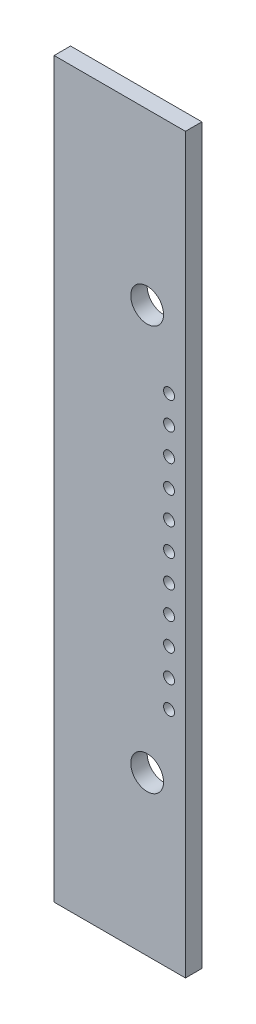
ISO-10303-21;
HEADER;
FILE_DESCRIPTION(('STEP AP214'),'2;1');
FILE_NAME('part.step','',(''),(''),'','','');
FILE_SCHEMA(('AUTOMOTIVE_DESIGN { 1 0 10303 214 1 1 1 1 }'));
ENDSEC;
DATA;
#1=APPLICATION_CONTEXT('core data for automotive mechanical design processes');
#2=APPLICATION_PROTOCOL_DEFINITION('international standard','automotive_design',2000,#1);
#3=PRODUCT_CONTEXT('',#1,'mechanical');
#4=PRODUCT('Part','Part','',(#3));
#5=PRODUCT_RELATED_PRODUCT_CATEGORY('part','',(#4));
#6=PRODUCT_DEFINITION_FORMATION('','',#4);
#7=PRODUCT_DEFINITION_CONTEXT('part definition',#1,'design');
#8=PRODUCT_DEFINITION('design','',#6,#7);
#9=PRODUCT_DEFINITION_SHAPE('','',#8);
#10=(LENGTH_UNIT() NAMED_UNIT(*) SI_UNIT(.MILLI.,.METRE.));
#11=(NAMED_UNIT(*) PLANE_ANGLE_UNIT() SI_UNIT($,.RADIAN.));
#12=(NAMED_UNIT(*) SI_UNIT($,.STERADIAN.) SOLID_ANGLE_UNIT());
#13=UNCERTAINTY_MEASURE_WITH_UNIT(LENGTH_MEASURE(1.E-05),#10,'distance_accuracy_value','');
#14=(GEOMETRIC_REPRESENTATION_CONTEXT(3) GLOBAL_UNCERTAINTY_ASSIGNED_CONTEXT((#13)) GLOBAL_UNIT_ASSIGNED_CONTEXT((#10,
#11,#12)) REPRESENTATION_CONTEXT('',''));
#15=CARTESIAN_POINT('',(0.,0.,0.));
#16=DIRECTION('',(0.,0.,1.));
#17=DIRECTION('',(1.,0.,0.));
#18=AXIS2_PLACEMENT_3D('',#15,#16,#17);
#19=CARTESIAN_POINT('',(6.,33.5,0.75));
#20=DIRECTION('',(0.,-1.,0.));
#21=DIRECTION('',(0.,0.,-1.));
#22=AXIS2_PLACEMENT_3D('',#19,#20,#21);
#23=PLANE('',#22);
#24=DIRECTION('',(-1.,0.,0.));
#25=VECTOR('',#24,1.);
#26=CARTESIAN_POINT('',(6.,33.5,-0.75));
#27=LINE('',#26,#25);
#28=CARTESIAN_POINT('',(6.,33.5,-0.75));
#29=VERTEX_POINT('',#28);
#30=CARTESIAN_POINT('',(-6.,33.5,-0.75));
#31=VERTEX_POINT('',#30);
#32=EDGE_CURVE('E113',#29,#31,#27,.T.);
#33=ORIENTED_EDGE('',*,*,#32,.T.);
#34=DIRECTION('',(0.,0.,-1.));
#35=VECTOR('',#34,1.);
#36=CARTESIAN_POINT('',(-6.,33.5,0.75));
#37=LINE('',#36,#35);
#38=CARTESIAN_POINT('',(-6.,33.5,0.75));
#39=VERTEX_POINT('',#38);
#40=EDGE_CURVE('E11',#39,#31,#37,.T.);
#41=ORIENTED_EDGE('',*,*,#40,.F.);
#42=DIRECTION('',(-1.,0.,0.));
#43=VECTOR('',#42,1.);
#44=CARTESIAN_POINT('',(6.,33.5,0.75));
#45=LINE('',#44,#43);
#46=CARTESIAN_POINT('',(6.,33.5,0.75));
#47=VERTEX_POINT('',#46);
#48=EDGE_CURVE('E97',#47,#39,#45,.T.);
#49=ORIENTED_EDGE('',*,*,#48,.F.);
#50=DIRECTION('',(0.,0.,-1.));
#51=VECTOR('',#50,1.);
#52=CARTESIAN_POINT('',(6.,33.5,0.75));
#53=LINE('',#52,#51);
#54=EDGE_CURVE('E109',#47,#29,#53,.T.);
#55=ORIENTED_EDGE('',*,*,#54,.T.);
#56=EDGE_LOOP('',(#33,#41,#49,#55));
#57=FACE_BOUND('',#56,.T.);
#58=ADVANCED_FACE('F45',(#57),#23,.F.);
#59=CARTESIAN_POINT('',(-6.,-33.5,0.75));
#60=DIRECTION('',(1.,0.,0.));
#61=DIRECTION('',(0.,0.,-1.));
#62=AXIS2_PLACEMENT_3D('',#59,#60,#61);
#63=PLANE('',#62);
#64=DIRECTION('',(0.,-1.,0.));
#65=VECTOR('',#64,1.);
#66=CARTESIAN_POINT('',(-6.,-33.5,-0.75));
#67=LINE('',#66,#65);
#68=CARTESIAN_POINT('',(-6.,-33.5,-0.75));
#69=VERTEX_POINT('',#68);
#70=EDGE_CURVE('E102',#31,#69,#67,.T.);
#71=ORIENTED_EDGE('',*,*,#70,.T.);
#72=DIRECTION('',(0.,0.,-1.));
#73=VECTOR('',#72,1.);
#74=CARTESIAN_POINT('',(-6.,-33.5,0.75));
#75=LINE('',#74,#73);
#76=CARTESIAN_POINT('',(-6.,-33.5,0.75));
#77=VERTEX_POINT('',#76);
#78=EDGE_CURVE('E54',#77,#69,#75,.T.);
#79=ORIENTED_EDGE('',*,*,#78,.F.);
#80=DIRECTION('',(0.,-1.,0.));
#81=VECTOR('',#80,1.);
#82=CARTESIAN_POINT('',(-6.,-33.5,0.75));
#83=LINE('',#82,#81);
#84=EDGE_CURVE('E92',#39,#77,#83,.T.);
#85=ORIENTED_EDGE('',*,*,#84,.F.);
#86=ORIENTED_EDGE('',*,*,#40,.T.);
#87=EDGE_LOOP('',(#71,#79,#85,#86));
#88=FACE_BOUND('',#87,.T.);
#89=ADVANCED_FACE('F101',(#88),#63,.F.);
#90=CARTESIAN_POINT('',(6.,-33.5,0.75));
#91=DIRECTION('',(0.,1.,0.));
#92=DIRECTION('',(0.,0.,1.));
#93=AXIS2_PLACEMENT_3D('',#90,#91,#92);
#94=PLANE('',#93);
#95=DIRECTION('',(1.,0.,0.));
#96=VECTOR('',#95,1.);
#97=CARTESIAN_POINT('',(6.,-33.5,-0.75));
#98=LINE('',#97,#96);
#99=CARTESIAN_POINT('',(6.,-33.5,-0.75));
#100=VERTEX_POINT('',#99);
#101=EDGE_CURVE('E79',#69,#100,#98,.T.);
#102=ORIENTED_EDGE('',*,*,#101,.T.);
#103=DIRECTION('',(0.,0.,-1.));
#104=VECTOR('',#103,1.);
#105=CARTESIAN_POINT('',(6.,-33.5,0.75));
#106=LINE('',#105,#104);
#107=CARTESIAN_POINT('',(6.,-33.5,0.75));
#108=VERTEX_POINT('',#107);
#109=EDGE_CURVE('E104',#108,#100,#106,.T.);
#110=ORIENTED_EDGE('',*,*,#109,.F.);
#111=DIRECTION('',(1.,0.,0.));
#112=VECTOR('',#111,1.);
#113=CARTESIAN_POINT('',(6.,-33.5,0.75));
#114=LINE('',#113,#112);
#115=EDGE_CURVE('E95',#77,#108,#114,.T.);
#116=ORIENTED_EDGE('',*,*,#115,.F.);
#117=ORIENTED_EDGE('',*,*,#78,.T.);
#118=EDGE_LOOP('',(#102,#110,#116,#117));
#119=FACE_BOUND('',#118,.T.);
#120=ADVANCED_FACE('F105',(#119),#94,.F.);
#121=CARTESIAN_POINT('',(6.,-33.5,0.75));
#122=DIRECTION('',(-1.,0.,0.));
#123=DIRECTION('',(0.,0.,1.));
#124=AXIS2_PLACEMENT_3D('',#121,#122,#123);
#125=PLANE('',#124);
#126=DIRECTION('',(0.,1.,0.));
#127=VECTOR('',#126,1.);
#128=CARTESIAN_POINT('',(6.,-33.5,-0.75));
#129=LINE('',#128,#127);
#130=EDGE_CURVE('E85',#100,#29,#129,.T.);
#131=ORIENTED_EDGE('',*,*,#130,.T.);
#132=ORIENTED_EDGE('',*,*,#54,.F.);
#133=DIRECTION('',(0.,1.,0.));
#134=VECTOR('',#133,1.);
#135=CARTESIAN_POINT('',(6.,-33.5,0.75));
#136=LINE('',#135,#134);
#137=EDGE_CURVE('E62',#108,#47,#136,.T.);
#138=ORIENTED_EDGE('',*,*,#137,.F.);
#139=ORIENTED_EDGE('',*,*,#109,.T.);
#140=EDGE_LOOP('',(#131,#132,#138,#139));
#141=FACE_BOUND('',#140,.T.);
#142=ADVANCED_FACE('F127',(#141),#125,.F.);
#143=CARTESIAN_POINT('',(0.,0.,0.75));
#144=DIRECTION('',(0.,0.,-1.));
#145=DIRECTION('',(-1.,0.,0.));
#146=AXIS2_PLACEMENT_3D('',#143,#144,#145);
#147=PLANE('',#146);
#148=CARTESIAN_POINT('',(2.5,-19.,0.75));
#149=DIRECTION('',(0.,0.,1.));
#150=DIRECTION('',(1.,0.,0.));
#151=AXIS2_PLACEMENT_3D('',#148,#149,#150);
#152=CIRCLE('',#151,1.5);
#153=CARTESIAN_POINT('',(4.,-19.,0.75));
#154=VERTEX_POINT('',#153);
#155=EDGE_CURVE('E230',#154,#154,#152,.T.);
#156=ORIENTED_EDGE('',*,*,#155,.F.);
#157=EDGE_LOOP('',(#156));
#158=FACE_BOUND('',#157,.T.);
#159=CARTESIAN_POINT('',(2.49999999999987,18.,0.75));
#160=DIRECTION('',(0.,0.,1.));
#161=DIRECTION('',(1.,0.,0.));
#162=AXIS2_PLACEMENT_3D('',#159,#160,#161);
#163=CIRCLE('',#162,1.5);
#164=CARTESIAN_POINT('',(3.99999999999988,18.,0.75));
#165=VERTEX_POINT('',#164);
#166=EDGE_CURVE('E226',#165,#165,#163,.T.);
#167=ORIENTED_EDGE('',*,*,#166,.F.);
#168=EDGE_LOOP('',(#167));
#169=FACE_BOUND('',#168,.T.);
#170=CARTESIAN_POINT('',(4.5,-13.,0.75));
#171=DIRECTION('',(0.,0.,1.));
#172=DIRECTION('',(1.,0.,0.));
#173=AXIS2_PLACEMENT_3D('',#170,#171,#172);
#174=CIRCLE('',#173,0.500000000000001);
#175=CARTESIAN_POINT('',(5.,-13.,0.75));
#176=VERTEX_POINT('',#175);
#177=EDGE_CURVE('E215',#176,#176,#174,.T.);
#178=ORIENTED_EDGE('',*,*,#177,.F.);
#179=EDGE_LOOP('',(#178));
#180=FACE_BOUND('',#179,.T.);
#181=CARTESIAN_POINT('',(4.49999999999999,-10.5,0.75));
#182=DIRECTION('',(0.,0.,1.));
#183=DIRECTION('',(1.,0.,0.));
#184=AXIS2_PLACEMENT_3D('',#181,#182,#183);
#185=CIRCLE('',#184,0.500000000000001);
#186=CARTESIAN_POINT('',(4.99999999999999,-10.5,0.75));
#187=VERTEX_POINT('',#186);
#188=EDGE_CURVE('E211',#187,#187,#185,.T.);
#189=ORIENTED_EDGE('',*,*,#188,.F.);
#190=EDGE_LOOP('',(#189));
#191=FACE_BOUND('',#190,.T.);
#192=CARTESIAN_POINT('',(4.49999999999998,-8.00000000000001,0.75));
#193=DIRECTION('',(0.,0.,1.));
#194=DIRECTION('',(1.,0.,0.));
#195=AXIS2_PLACEMENT_3D('',#192,#193,#194);
#196=CIRCLE('',#195,0.500000000000001);
#197=CARTESIAN_POINT('',(4.99999999999998,-8.00000000000001,0.75));
#198=VERTEX_POINT('',#197);
#199=EDGE_CURVE('E203',#198,#198,#196,.T.);
#200=ORIENTED_EDGE('',*,*,#199,.F.);
#201=EDGE_LOOP('',(#200));
#202=FACE_BOUND('',#201,.T.);
#203=CARTESIAN_POINT('',(4.49999999999997,-5.50000000000001,0.75));
#204=DIRECTION('',(0.,0.,1.));
#205=DIRECTION('',(1.,0.,0.));
#206=AXIS2_PLACEMENT_3D('',#203,#204,#205);
#207=CIRCLE('',#206,0.500000000000001);
#208=CARTESIAN_POINT('',(4.99999999999998,-5.50000000000001,0.75));
#209=VERTEX_POINT('',#208);
#210=EDGE_CURVE('E195',#209,#209,#207,.T.);
#211=ORIENTED_EDGE('',*,*,#210,.F.);
#212=EDGE_LOOP('',(#211));
#213=FACE_BOUND('',#212,.T.);
#214=CARTESIAN_POINT('',(4.49999999999997,-3.00000000000001,0.75));
#215=DIRECTION('',(0.,0.,1.));
#216=DIRECTION('',(1.,0.,0.));
#217=AXIS2_PLACEMENT_3D('',#214,#215,#216);
#218=CIRCLE('',#217,0.500000000000001);
#219=CARTESIAN_POINT('',(4.99999999999997,-3.00000000000001,0.75));
#220=VERTEX_POINT('',#219);
#221=EDGE_CURVE('E187',#220,#220,#218,.T.);
#222=ORIENTED_EDGE('',*,*,#221,.F.);
#223=EDGE_LOOP('',(#222));
#224=FACE_BOUND('',#223,.T.);
#225=CARTESIAN_POINT('',(4.49999999999996,-0.500000000000007,0.75));
#226=DIRECTION('',(0.,0.,1.));
#227=DIRECTION('',(1.,0.,0.));
#228=AXIS2_PLACEMENT_3D('',#225,#226,#227);
#229=CIRCLE('',#228,0.500000000000002);
#230=CARTESIAN_POINT('',(4.99999999999996,-0.500000000000007,0.75));
#231=VERTEX_POINT('',#230);
#232=EDGE_CURVE('E179',#231,#231,#229,.T.);
#233=ORIENTED_EDGE('',*,*,#232,.F.);
#234=EDGE_LOOP('',(#233));
#235=FACE_BOUND('',#234,.T.);
#236=CARTESIAN_POINT('',(4.49999999999995,1.99999999999999,0.75));
#237=DIRECTION('',(0.,0.,1.));
#238=DIRECTION('',(1.,0.,0.));
#239=AXIS2_PLACEMENT_3D('',#236,#237,#238);
#240=CIRCLE('',#239,0.500000000000002);
#241=CARTESIAN_POINT('',(4.99999999999995,1.99999999999999,0.75));
#242=VERTEX_POINT('',#241);
#243=EDGE_CURVE('E171',#242,#242,#240,.T.);
#244=ORIENTED_EDGE('',*,*,#243,.F.);
#245=EDGE_LOOP('',(#244));
#246=FACE_BOUND('',#245,.T.);
#247=CARTESIAN_POINT('',(4.49999999999994,4.49999999999999,0.75));
#248=DIRECTION('',(0.,0.,1.));
#249=DIRECTION('',(1.,0.,0.));
#250=AXIS2_PLACEMENT_3D('',#247,#248,#249);
#251=CIRCLE('',#250,0.500000000000002);
#252=CARTESIAN_POINT('',(4.99999999999994,4.49999999999999,0.75));
#253=VERTEX_POINT('',#252);
#254=EDGE_CURVE('E163',#253,#253,#251,.T.);
#255=ORIENTED_EDGE('',*,*,#254,.F.);
#256=EDGE_LOOP('',(#255));
#257=FACE_BOUND('',#256,.T.);
#258=CARTESIAN_POINT('',(4.49999999999993,6.99999999999999,0.75));
#259=DIRECTION('',(0.,0.,1.));
#260=DIRECTION('',(1.,0.,0.));
#261=AXIS2_PLACEMENT_3D('',#258,#259,#260);
#262=CIRCLE('',#261,0.500000000000002);
#263=CARTESIAN_POINT('',(4.99999999999993,6.99999999999999,0.75));
#264=VERTEX_POINT('',#263);
#265=EDGE_CURVE('E155',#264,#264,#262,.T.);
#266=ORIENTED_EDGE('',*,*,#265,.F.);
#267=EDGE_LOOP('',(#266));
#268=FACE_BOUND('',#267,.T.);
#269=CARTESIAN_POINT('',(4.49999999999992,9.49999999999999,0.75));
#270=DIRECTION('',(0.,0.,1.));
#271=DIRECTION('',(1.,0.,0.));
#272=AXIS2_PLACEMENT_3D('',#269,#270,#271);
#273=CIRCLE('',#272,0.500000000000002);
#274=CARTESIAN_POINT('',(4.99999999999992,9.49999999999999,0.75));
#275=VERTEX_POINT('',#274);
#276=EDGE_CURVE('E147',#275,#275,#273,.T.);
#277=ORIENTED_EDGE('',*,*,#276,.F.);
#278=EDGE_LOOP('',(#277));
#279=FACE_BOUND('',#278,.T.);
#280=CARTESIAN_POINT('',(4.49999999999991,12.,0.75));
#281=DIRECTION('',(0.,0.,1.));
#282=DIRECTION('',(1.,0.,0.));
#283=AXIS2_PLACEMENT_3D('',#280,#281,#282);
#284=CIRCLE('',#283,0.500000000000002);
#285=CARTESIAN_POINT('',(4.99999999999992,12.,0.75));
#286=VERTEX_POINT('',#285);
#287=EDGE_CURVE('E138',#286,#286,#284,.T.);
#288=ORIENTED_EDGE('',*,*,#287,.F.);
#289=EDGE_LOOP('',(#288));
#290=FACE_BOUND('',#289,.T.);
#291=ORIENTED_EDGE('',*,*,#48,.T.);
#292=ORIENTED_EDGE('',*,*,#84,.T.);
#293=ORIENTED_EDGE('',*,*,#115,.T.);
#294=ORIENTED_EDGE('',*,*,#137,.T.);
#295=EDGE_LOOP('',(#291,#292,#293,#294));
#296=FACE_BOUND('',#295,.T.);
#297=ADVANCED_FACE('F93',(#158,#169,#180,#191,#202,#213,#224,#235,#246,#257,#268,#279,#290,
#296),#147,.F.);
#298=CARTESIAN_POINT('',(0.,0.,-0.75));
#299=DIRECTION('',(0.,0.,-1.));
#300=DIRECTION('',(-1.,0.,0.));
#301=AXIS2_PLACEMENT_3D('',#298,#299,#300);
#302=PLANE('',#301);
#303=CARTESIAN_POINT('',(2.5,-19.,-0.75));
#304=DIRECTION('',(0.,0.,1.));
#305=DIRECTION('',(1.,0.,0.));
#306=AXIS2_PLACEMENT_3D('',#303,#304,#305);
#307=CIRCLE('',#306,1.5);
#308=CARTESIAN_POINT('',(4.,-19.,-0.75));
#309=VERTEX_POINT('',#308);
#310=EDGE_CURVE('E139',#309,#309,#307,.T.);
#311=ORIENTED_EDGE('',*,*,#310,.T.);
#312=EDGE_LOOP('',(#311));
#313=FACE_BOUND('',#312,.T.);
#314=CARTESIAN_POINT('',(2.49999999999987,18.,-0.75));
#315=DIRECTION('',(0.,0.,1.));
#316=DIRECTION('',(1.,0.,0.));
#317=AXIS2_PLACEMENT_3D('',#314,#315,#316);
#318=CIRCLE('',#317,1.5);
#319=CARTESIAN_POINT('',(3.99999999999988,18.,-0.75));
#320=VERTEX_POINT('',#319);
#321=EDGE_CURVE('E222',#320,#320,#318,.T.);
#322=ORIENTED_EDGE('',*,*,#321,.T.);
#323=EDGE_LOOP('',(#322));
#324=FACE_BOUND('',#323,.T.);
#325=CARTESIAN_POINT('',(4.5,-13.,-0.75));
#326=DIRECTION('',(0.,0.,1.));
#327=DIRECTION('',(1.,0.,0.));
#328=AXIS2_PLACEMENT_3D('',#325,#326,#327);
#329=CIRCLE('',#328,0.500000000000001);
#330=CARTESIAN_POINT('',(5.,-13.,-0.75));
#331=VERTEX_POINT('',#330);
#332=EDGE_CURVE('E117',#331,#331,#329,.T.);
#333=ORIENTED_EDGE('',*,*,#332,.T.);
#334=EDGE_LOOP('',(#333));
#335=FACE_BOUND('',#334,.T.);
#336=CARTESIAN_POINT('',(4.49999999999999,-10.5,-0.75));
#337=DIRECTION('',(0.,0.,1.));
#338=DIRECTION('',(1.,0.,0.));
#339=AXIS2_PLACEMENT_3D('',#336,#337,#338);
#340=CIRCLE('',#339,0.500000000000001);
#341=CARTESIAN_POINT('',(4.99999999999999,-10.5,-0.75));
#342=VERTEX_POINT('',#341);
#343=EDGE_CURVE('E207',#342,#342,#340,.T.);
#344=ORIENTED_EDGE('',*,*,#343,.T.);
#345=EDGE_LOOP('',(#344));
#346=FACE_BOUND('',#345,.T.);
#347=CARTESIAN_POINT('',(4.49999999999998,-8.00000000000001,-0.75));
#348=DIRECTION('',(0.,0.,1.));
#349=DIRECTION('',(1.,0.,0.));
#350=AXIS2_PLACEMENT_3D('',#347,#348,#349);
#351=CIRCLE('',#350,0.500000000000001);
#352=CARTESIAN_POINT('',(4.99999999999998,-8.00000000000001,-0.75));
#353=VERTEX_POINT('',#352);
#354=EDGE_CURVE('E199',#353,#353,#351,.T.);
#355=ORIENTED_EDGE('',*,*,#354,.T.);
#356=EDGE_LOOP('',(#355));
#357=FACE_BOUND('',#356,.T.);
#358=CARTESIAN_POINT('',(4.49999999999997,-5.50000000000001,-0.75));
#359=DIRECTION('',(0.,0.,1.));
#360=DIRECTION('',(1.,0.,0.));
#361=AXIS2_PLACEMENT_3D('',#358,#359,#360);
#362=CIRCLE('',#361,0.500000000000001);
#363=CARTESIAN_POINT('',(4.99999999999998,-5.50000000000001,-0.75));
#364=VERTEX_POINT('',#363);
#365=EDGE_CURVE('E191',#364,#364,#362,.T.);
#366=ORIENTED_EDGE('',*,*,#365,.T.);
#367=EDGE_LOOP('',(#366));
#368=FACE_BOUND('',#367,.T.);
#369=CARTESIAN_POINT('',(4.49999999999997,-3.00000000000001,-0.75));
#370=DIRECTION('',(0.,0.,1.));
#371=DIRECTION('',(1.,0.,0.));
#372=AXIS2_PLACEMENT_3D('',#369,#370,#371);
#373=CIRCLE('',#372,0.500000000000001);
#374=CARTESIAN_POINT('',(4.99999999999997,-3.00000000000001,-0.75));
#375=VERTEX_POINT('',#374);
#376=EDGE_CURVE('E183',#375,#375,#373,.T.);
#377=ORIENTED_EDGE('',*,*,#376,.T.);
#378=EDGE_LOOP('',(#377));
#379=FACE_BOUND('',#378,.T.);
#380=CARTESIAN_POINT('',(4.49999999999996,-0.500000000000007,-0.75));
#381=DIRECTION('',(0.,0.,1.));
#382=DIRECTION('',(1.,0.,0.));
#383=AXIS2_PLACEMENT_3D('',#380,#381,#382);
#384=CIRCLE('',#383,0.500000000000002);
#385=CARTESIAN_POINT('',(4.99999999999996,-0.500000000000007,-0.75));
#386=VERTEX_POINT('',#385);
#387=EDGE_CURVE('E175',#386,#386,#384,.T.);
#388=ORIENTED_EDGE('',*,*,#387,.T.);
#389=EDGE_LOOP('',(#388));
#390=FACE_BOUND('',#389,.T.);
#391=CARTESIAN_POINT('',(4.49999999999995,1.99999999999999,-0.75));
#392=DIRECTION('',(0.,0.,1.));
#393=DIRECTION('',(1.,0.,0.));
#394=AXIS2_PLACEMENT_3D('',#391,#392,#393);
#395=CIRCLE('',#394,0.500000000000002);
#396=CARTESIAN_POINT('',(4.99999999999995,1.99999999999999,-0.75));
#397=VERTEX_POINT('',#396);
#398=EDGE_CURVE('E167',#397,#397,#395,.T.);
#399=ORIENTED_EDGE('',*,*,#398,.T.);
#400=EDGE_LOOP('',(#399));
#401=FACE_BOUND('',#400,.T.);
#402=CARTESIAN_POINT('',(4.49999999999994,4.49999999999999,-0.75));
#403=DIRECTION('',(0.,0.,1.));
#404=DIRECTION('',(1.,0.,0.));
#405=AXIS2_PLACEMENT_3D('',#402,#403,#404);
#406=CIRCLE('',#405,0.500000000000002);
#407=CARTESIAN_POINT('',(4.99999999999994,4.49999999999999,-0.75));
#408=VERTEX_POINT('',#407);
#409=EDGE_CURVE('E159',#408,#408,#406,.T.);
#410=ORIENTED_EDGE('',*,*,#409,.T.);
#411=EDGE_LOOP('',(#410));
#412=FACE_BOUND('',#411,.T.);
#413=CARTESIAN_POINT('',(4.49999999999993,6.99999999999999,-0.75));
#414=DIRECTION('',(0.,0.,1.));
#415=DIRECTION('',(1.,0.,0.));
#416=AXIS2_PLACEMENT_3D('',#413,#414,#415);
#417=CIRCLE('',#416,0.500000000000002);
#418=CARTESIAN_POINT('',(4.99999999999993,6.99999999999999,-0.75));
#419=VERTEX_POINT('',#418);
#420=EDGE_CURVE('E151',#419,#419,#417,.T.);
#421=ORIENTED_EDGE('',*,*,#420,.T.);
#422=EDGE_LOOP('',(#421));
#423=FACE_BOUND('',#422,.T.);
#424=CARTESIAN_POINT('',(4.49999999999992,9.49999999999999,-0.75));
#425=DIRECTION('',(0.,0.,1.));
#426=DIRECTION('',(1.,0.,0.));
#427=AXIS2_PLACEMENT_3D('',#424,#425,#426);
#428=CIRCLE('',#427,0.500000000000002);
#429=CARTESIAN_POINT('',(4.99999999999992,9.49999999999999,-0.75));
#430=VERTEX_POINT('',#429);
#431=EDGE_CURVE('E143',#430,#430,#428,.T.);
#432=ORIENTED_EDGE('',*,*,#431,.T.);
#433=EDGE_LOOP('',(#432));
#434=FACE_BOUND('',#433,.T.);
#435=CARTESIAN_POINT('',(4.49999999999991,12.,-0.75));
#436=DIRECTION('',(0.,0.,1.));
#437=DIRECTION('',(1.,0.,0.));
#438=AXIS2_PLACEMENT_3D('',#435,#436,#437);
#439=CIRCLE('',#438,0.500000000000002);
#440=CARTESIAN_POINT('',(4.99999999999992,12.,-0.75));
#441=VERTEX_POINT('',#440);
#442=EDGE_CURVE('E134',#441,#441,#439,.T.);
#443=ORIENTED_EDGE('',*,*,#442,.T.);
#444=EDGE_LOOP('',(#443));
#445=FACE_BOUND('',#444,.T.);
#446=ORIENTED_EDGE('',*,*,#32,.F.);
#447=ORIENTED_EDGE('',*,*,#130,.F.);
#448=ORIENTED_EDGE('',*,*,#101,.F.);
#449=ORIENTED_EDGE('',*,*,#70,.F.);
#450=EDGE_LOOP('',(#446,#447,#448,#449));
#451=FACE_BOUND('',#450,.T.);
#452=ADVANCED_FACE('F130',(#313,#324,#335,#346,#357,#368,#379,#390,#401,#412,#423,#434,#445,
#451),#302,.T.);
#453=CARTESIAN_POINT('',(4.49999999999991,12.,-0.75));
#454=DIRECTION('',(0.,0.,1.));
#455=DIRECTION('',(1.,0.,0.));
#456=AXIS2_PLACEMENT_3D('',#453,#454,#455);
#457=CYLINDRICAL_SURFACE('',#456,0.500000000000002);
#458=ORIENTED_EDGE('',*,*,#442,.F.);
#459=EDGE_LOOP('',(#458));
#460=FACE_BOUND('',#459,.T.);
#461=ORIENTED_EDGE('',*,*,#287,.T.);
#462=EDGE_LOOP('',(#461));
#463=FACE_BOUND('',#462,.T.);
#464=ADVANCED_FACE('F274',(#460,#463),#457,.F.);
#465=CARTESIAN_POINT('',(4.49999999999992,9.49999999999999,-0.75));
#466=DIRECTION('',(0.,0.,1.));
#467=DIRECTION('',(1.,0.,0.));
#468=AXIS2_PLACEMENT_3D('',#465,#466,#467);
#469=CYLINDRICAL_SURFACE('',#468,0.500000000000002);
#470=ORIENTED_EDGE('',*,*,#431,.F.);
#471=EDGE_LOOP('',(#470));
#472=FACE_BOUND('',#471,.T.);
#473=ORIENTED_EDGE('',*,*,#276,.T.);
#474=EDGE_LOOP('',(#473));
#475=FACE_BOUND('',#474,.T.);
#476=ADVANCED_FACE('F276',(#472,#475),#469,.F.);
#477=CARTESIAN_POINT('',(4.49999999999993,6.99999999999999,-0.75));
#478=DIRECTION('',(0.,0.,1.));
#479=DIRECTION('',(1.,0.,0.));
#480=AXIS2_PLACEMENT_3D('',#477,#478,#479);
#481=CYLINDRICAL_SURFACE('',#480,0.500000000000002);
#482=ORIENTED_EDGE('',*,*,#420,.F.);
#483=EDGE_LOOP('',(#482));
#484=FACE_BOUND('',#483,.T.);
#485=ORIENTED_EDGE('',*,*,#265,.T.);
#486=EDGE_LOOP('',(#485));
#487=FACE_BOUND('',#486,.T.);
#488=ADVANCED_FACE('F283',(#484,#487),#481,.F.);
#489=CARTESIAN_POINT('',(4.49999999999994,4.49999999999999,-0.75));
#490=DIRECTION('',(0.,0.,1.));
#491=DIRECTION('',(1.,0.,0.));
#492=AXIS2_PLACEMENT_3D('',#489,#490,#491);
#493=CYLINDRICAL_SURFACE('',#492,0.500000000000002);
#494=ORIENTED_EDGE('',*,*,#409,.F.);
#495=EDGE_LOOP('',(#494));
#496=FACE_BOUND('',#495,.T.);
#497=ORIENTED_EDGE('',*,*,#254,.T.);
#498=EDGE_LOOP('',(#497));
#499=FACE_BOUND('',#498,.T.);
#500=ADVANCED_FACE('F342',(#496,#499),#493,.F.);
#501=CARTESIAN_POINT('',(4.49999999999995,1.99999999999999,-0.75));
#502=DIRECTION('',(0.,0.,1.));
#503=DIRECTION('',(1.,0.,0.));
#504=AXIS2_PLACEMENT_3D('',#501,#502,#503);
#505=CYLINDRICAL_SURFACE('',#504,0.500000000000002);
#506=ORIENTED_EDGE('',*,*,#398,.F.);
#507=EDGE_LOOP('',(#506));
#508=FACE_BOUND('',#507,.T.);
#509=ORIENTED_EDGE('',*,*,#243,.T.);
#510=EDGE_LOOP('',(#509));
#511=FACE_BOUND('',#510,.T.);
#512=ADVANCED_FACE('F351',(#508,#511),#505,.F.);
#513=CARTESIAN_POINT('',(4.49999999999996,-0.500000000000007,-0.75));
#514=DIRECTION('',(0.,0.,1.));
#515=DIRECTION('',(1.,0.,0.));
#516=AXIS2_PLACEMENT_3D('',#513,#514,#515);
#517=CYLINDRICAL_SURFACE('',#516,0.500000000000002);
#518=ORIENTED_EDGE('',*,*,#387,.F.);
#519=EDGE_LOOP('',(#518));
#520=FACE_BOUND('',#519,.T.);
#521=ORIENTED_EDGE('',*,*,#232,.T.);
#522=EDGE_LOOP('',(#521));
#523=FACE_BOUND('',#522,.T.);
#524=ADVANCED_FACE('F360',(#520,#523),#517,.F.);
#525=CARTESIAN_POINT('',(4.49999999999997,-3.00000000000001,-0.75));
#526=DIRECTION('',(0.,0.,1.));
#527=DIRECTION('',(1.,0.,0.));
#528=AXIS2_PLACEMENT_3D('',#525,#526,#527);
#529=CYLINDRICAL_SURFACE('',#528,0.500000000000001);
#530=ORIENTED_EDGE('',*,*,#376,.F.);
#531=EDGE_LOOP('',(#530));
#532=FACE_BOUND('',#531,.T.);
#533=ORIENTED_EDGE('',*,*,#221,.T.);
#534=EDGE_LOOP('',(#533));
#535=FACE_BOUND('',#534,.T.);
#536=ADVANCED_FACE('F369',(#532,#535),#529,.F.);
#537=CARTESIAN_POINT('',(4.49999999999997,-5.50000000000001,-0.75));
#538=DIRECTION('',(0.,0.,1.));
#539=DIRECTION('',(1.,0.,0.));
#540=AXIS2_PLACEMENT_3D('',#537,#538,#539);
#541=CYLINDRICAL_SURFACE('',#540,0.500000000000001);
#542=ORIENTED_EDGE('',*,*,#365,.F.);
#543=EDGE_LOOP('',(#542));
#544=FACE_BOUND('',#543,.T.);
#545=ORIENTED_EDGE('',*,*,#210,.T.);
#546=EDGE_LOOP('',(#545));
#547=FACE_BOUND('',#546,.T.);
#548=ADVANCED_FACE('F378',(#544,#547),#541,.F.);
#549=CARTESIAN_POINT('',(4.49999999999998,-8.00000000000001,-0.75));
#550=DIRECTION('',(0.,0.,1.));
#551=DIRECTION('',(1.,0.,0.));
#552=AXIS2_PLACEMENT_3D('',#549,#550,#551);
#553=CYLINDRICAL_SURFACE('',#552,0.500000000000001);
#554=ORIENTED_EDGE('',*,*,#354,.F.);
#555=EDGE_LOOP('',(#554));
#556=FACE_BOUND('',#555,.T.);
#557=ORIENTED_EDGE('',*,*,#199,.T.);
#558=EDGE_LOOP('',(#557));
#559=FACE_BOUND('',#558,.T.);
#560=ADVANCED_FACE('F387',(#556,#559),#553,.F.);
#561=CARTESIAN_POINT('',(4.49999999999999,-10.5,-0.75));
#562=DIRECTION('',(0.,0.,1.));
#563=DIRECTION('',(1.,0.,0.));
#564=AXIS2_PLACEMENT_3D('',#561,#562,#563);
#565=CYLINDRICAL_SURFACE('',#564,0.500000000000001);
#566=ORIENTED_EDGE('',*,*,#343,.F.);
#567=EDGE_LOOP('',(#566));
#568=FACE_BOUND('',#567,.T.);
#569=ORIENTED_EDGE('',*,*,#188,.T.);
#570=EDGE_LOOP('',(#569));
#571=FACE_BOUND('',#570,.T.);
#572=ADVANCED_FACE('F396',(#568,#571),#565,.F.);
#573=CARTESIAN_POINT('',(4.5,-13.,-0.75));
#574=DIRECTION('',(0.,0.,1.));
#575=DIRECTION('',(1.,0.,0.));
#576=AXIS2_PLACEMENT_3D('',#573,#574,#575);
#577=CYLINDRICAL_SURFACE('',#576,0.500000000000001);
#578=ORIENTED_EDGE('',*,*,#332,.F.);
#579=EDGE_LOOP('',(#578));
#580=FACE_BOUND('',#579,.T.);
#581=ORIENTED_EDGE('',*,*,#177,.T.);
#582=EDGE_LOOP('',(#581));
#583=FACE_BOUND('',#582,.T.);
#584=ADVANCED_FACE('F405',(#580,#583),#577,.F.);
#585=CARTESIAN_POINT('',(2.49999999999987,18.,-0.75));
#586=DIRECTION('',(0.,0.,1.));
#587=DIRECTION('',(1.,0.,0.));
#588=AXIS2_PLACEMENT_3D('',#585,#586,#587);
#589=CYLINDRICAL_SURFACE('',#588,1.5);
#590=ORIENTED_EDGE('',*,*,#321,.F.);
#591=EDGE_LOOP('',(#590));
#592=FACE_BOUND('',#591,.T.);
#593=ORIENTED_EDGE('',*,*,#166,.T.);
#594=EDGE_LOOP('',(#593));
#595=FACE_BOUND('',#594,.T.);
#596=ADVANCED_FACE('F243',(#592,#595),#589,.F.);
#597=CARTESIAN_POINT('',(2.5,-19.,-0.75));
#598=DIRECTION('',(0.,0.,1.));
#599=DIRECTION('',(1.,0.,0.));
#600=AXIS2_PLACEMENT_3D('',#597,#598,#599);
#601=CYLINDRICAL_SURFACE('',#600,1.5);
#602=ORIENTED_EDGE('',*,*,#310,.F.);
#603=EDGE_LOOP('',(#602));
#604=FACE_BOUND('',#603,.T.);
#605=ORIENTED_EDGE('',*,*,#155,.T.);
#606=EDGE_LOOP('',(#605));
#607=FACE_BOUND('',#606,.T.);
#608=ADVANCED_FACE('F240',(#604,#607),#601,.F.);
#609=CLOSED_SHELL('',(#58,#89,#120,#142,#297,#452,#464,#476,#488,#500,#512,#524,#536,#548,#560,
#572,#584,#596,#608));
#610=MANIFOLD_SOLID_BREP('B2',#609);
#611=ADVANCED_BREP_SHAPE_REPRESENTATION('',(#18,#610),#14);
#612=SHAPE_DEFINITION_REPRESENTATION(#9,#611);
ENDSEC;
END-ISO-10303-21;
